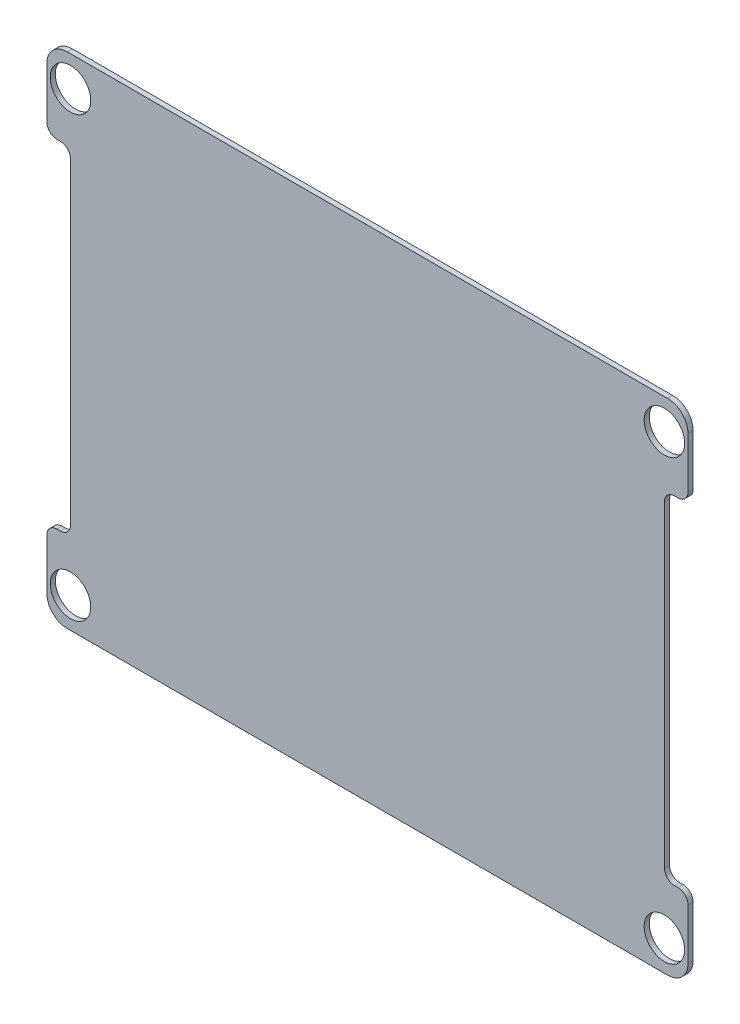
ISO-10303-21;
HEADER;
FILE_DESCRIPTION(('STEP AP214'),'2;1');
FILE_NAME('part.step','',(''),(''),'','','');
FILE_SCHEMA(('AUTOMOTIVE_DESIGN { 1 0 10303 214 1 1 1 1 }'));
ENDSEC;
DATA;
#1=APPLICATION_CONTEXT('core data for automotive mechanical design processes');
#2=APPLICATION_PROTOCOL_DEFINITION('international standard','automotive_design',2000,#1);
#3=PRODUCT_CONTEXT('',#1,'mechanical');
#4=PRODUCT('Part','Part','',(#3));
#5=PRODUCT_RELATED_PRODUCT_CATEGORY('part','',(#4));
#6=PRODUCT_DEFINITION_FORMATION('','',#4);
#7=PRODUCT_DEFINITION_CONTEXT('part definition',#1,'design');
#8=PRODUCT_DEFINITION('design','',#6,#7);
#9=PRODUCT_DEFINITION_SHAPE('','',#8);
#10=(LENGTH_UNIT() NAMED_UNIT(*) SI_UNIT(.MILLI.,.METRE.));
#11=(NAMED_UNIT(*) PLANE_ANGLE_UNIT() SI_UNIT($,.RADIAN.));
#12=(NAMED_UNIT(*) SI_UNIT($,.STERADIAN.) SOLID_ANGLE_UNIT());
#13=UNCERTAINTY_MEASURE_WITH_UNIT(LENGTH_MEASURE(1.E-05),#10,'distance_accuracy_value','');
#14=(GEOMETRIC_REPRESENTATION_CONTEXT(3) GLOBAL_UNCERTAINTY_ASSIGNED_CONTEXT((#13)) GLOBAL_UNIT_ASSIGNED_CONTEXT((#10,
#11,#12)) REPRESENTATION_CONTEXT('',''));
#15=CARTESIAN_POINT('',(0.,0.,0.));
#16=DIRECTION('',(0.,0.,1.));
#17=DIRECTION('',(1.,0.,0.));
#18=AXIS2_PLACEMENT_3D('',#15,#16,#17);
#19=CARTESIAN_POINT('',(-47.5,37.,0.));
#20=DIRECTION('',(0.,0.,1.));
#21=DIRECTION('',(1.,0.,0.));
#22=AXIS2_PLACEMENT_3D('',#19,#20,#21);
#23=PLANE('',#22);
#24=CARTESIAN_POINT('',(-44.50000000001,34.00000000001,0.));
#25=DIRECTION('',(0.,0.,1.));
#26=DIRECTION('',(0.,-1.,0.));
#27=AXIS2_PLACEMENT_3D('',#24,#25,#26);
#28=CIRCLE('',#27,3.00000000001);
#29=CARTESIAN_POINT('',(-44.5,37.,0.));
#30=VERTEX_POINT('',#29);
#31=CARTESIAN_POINT('',(-47.5,34.,0.));
#32=VERTEX_POINT('',#31);
#33=EDGE_CURVE('E42',#30,#32,#28,.T.);
#34=ORIENTED_EDGE('',*,*,#33,.F.);
#35=DIRECTION('',(1.,0.,0.));
#36=VECTOR('',#35,1.);
#37=CARTESIAN_POINT('',(-47.50000000001,37.00000000001,0.));
#38=LINE('',#37,#36);
#39=CARTESIAN_POINT('',(44.5,37.,0.));
#40=VERTEX_POINT('',#39);
#41=EDGE_CURVE('E11',#30,#40,#38,.T.);
#42=ORIENTED_EDGE('',*,*,#41,.T.);
#43=CARTESIAN_POINT('',(44.50000000001,34.00000000001,0.));
#44=DIRECTION('',(0.,0.,-1.));
#45=DIRECTION('',(0.,-1.,0.));
#46=AXIS2_PLACEMENT_3D('',#43,#44,#45);
#47=CIRCLE('',#46,3.00000000001);
#48=CARTESIAN_POINT('',(47.5,34.,0.));
#49=VERTEX_POINT('',#48);
#50=EDGE_CURVE('E28',#40,#49,#47,.T.);
#51=ORIENTED_EDGE('',*,*,#50,.T.);
#52=DIRECTION('',(0.,-1.,0.));
#53=VECTOR('',#52,1.);
#54=CARTESIAN_POINT('',(47.50000000001,37.00000000001,0.));
#55=LINE('',#54,#53);
#56=CARTESIAN_POINT('',(47.5,26.5,0.));
#57=VERTEX_POINT('',#56);
#58=EDGE_CURVE('E298',#49,#57,#55,.T.);
#59=ORIENTED_EDGE('',*,*,#58,.T.);
#60=CARTESIAN_POINT('',(46.00000000001,26.50000000001,0.));
#61=DIRECTION('',(0.,0.,-1.));
#62=DIRECTION('',(0.,1.,0.));
#63=AXIS2_PLACEMENT_3D('',#60,#61,#62);
#64=CIRCLE('',#63,1.50000000001);
#65=CARTESIAN_POINT('',(46.,25.,0.));
#66=VERTEX_POINT('',#65);
#67=EDGE_CURVE('E314',#57,#66,#64,.T.);
#68=ORIENTED_EDGE('',*,*,#67,.T.);
#69=DIRECTION('',(1.,0.,0.));
#70=VECTOR('',#69,1.);
#71=CARTESIAN_POINT('',(-1.75000000001,25.00000000001,0.));
#72=LINE('',#71,#70);
#73=CARTESIAN_POINT('',(45.5,25.,0.));
#74=VERTEX_POINT('',#73);
#75=EDGE_CURVE('E231',#74,#66,#72,.T.);
#76=ORIENTED_EDGE('',*,*,#75,.F.);
#77=CARTESIAN_POINT('',(45.50000000001,23.50000000001,0.));
#78=DIRECTION('',(0.,0.,1.));
#79=DIRECTION('',(0.,1.,0.));
#80=AXIS2_PLACEMENT_3D('',#77,#78,#79);
#81=CIRCLE('',#80,1.50000000001);
#82=CARTESIAN_POINT('',(44.,23.5,0.));
#83=VERTEX_POINT('',#82);
#84=EDGE_CURVE('E317',#74,#83,#81,.T.);
#85=ORIENTED_EDGE('',*,*,#84,.T.);
#86=DIRECTION('',(0.,1.,0.));
#87=VECTOR('',#86,1.);
#88=CARTESIAN_POINT('',(44.00000000001,6.00000000001,0.));
#89=LINE('',#88,#87);
#90=CARTESIAN_POINT('',(44.,-23.5,0.));
#91=VERTEX_POINT('',#90);
#92=EDGE_CURVE('E327',#91,#83,#89,.T.);
#93=ORIENTED_EDGE('',*,*,#92,.F.);
#94=CARTESIAN_POINT('',(45.50000000001,-23.50000000001,0.));
#95=DIRECTION('',(0.,0.,1.));
#96=DIRECTION('',(0.,1.,0.));
#97=AXIS2_PLACEMENT_3D('',#94,#95,#96);
#98=CIRCLE('',#97,1.50000000001);
#99=CARTESIAN_POINT('',(45.5,-25.,0.));
#100=VERTEX_POINT('',#99);
#101=EDGE_CURVE('E318',#91,#100,#98,.T.);
#102=ORIENTED_EDGE('',*,*,#101,.T.);
#103=DIRECTION('',(-1.,0.,0.));
#104=VECTOR('',#103,1.);
#105=CARTESIAN_POINT('',(8.25000000001,-25.00000000001,0.));
#106=LINE('',#105,#104);
#107=CARTESIAN_POINT('',(46.,-25.,0.));
#108=VERTEX_POINT('',#107);
#109=EDGE_CURVE('E272',#108,#100,#106,.T.);
#110=ORIENTED_EDGE('',*,*,#109,.F.);
#111=CARTESIAN_POINT('',(46.00000000001,-26.50000000001,0.));
#112=DIRECTION('',(0.,0.,-1.));
#113=DIRECTION('',(0.,-1.,0.));
#114=AXIS2_PLACEMENT_3D('',#111,#112,#113);
#115=CIRCLE('',#114,1.50000000001);
#116=CARTESIAN_POINT('',(47.5,-26.5,0.));
#117=VERTEX_POINT('',#116);
#118=EDGE_CURVE('E322',#108,#117,#115,.T.);
#119=ORIENTED_EDGE('',*,*,#118,.T.);
#120=CARTESIAN_POINT('',(47.5,-34.,0.));
#121=VERTEX_POINT('',#120);
#122=EDGE_CURVE('E446',#117,#121,#55,.T.);
#123=ORIENTED_EDGE('',*,*,#122,.T.);
#124=CARTESIAN_POINT('',(44.50000000001,-34.00000000001,0.));
#125=DIRECTION('',(0.,0.,-1.));
#126=DIRECTION('',(0.,-1.,0.));
#127=AXIS2_PLACEMENT_3D('',#124,#125,#126);
#128=CIRCLE('',#127,3.00000000001);
#129=CARTESIAN_POINT('',(44.5,-37.,0.));
#130=VERTEX_POINT('',#129);
#131=EDGE_CURVE('E288',#121,#130,#128,.T.);
#132=ORIENTED_EDGE('',*,*,#131,.T.);
#133=DIRECTION('',(-1.,0.,0.));
#134=VECTOR('',#133,1.);
#135=CARTESIAN_POINT('',(47.50000000001,-37.00000000001,0.));
#136=LINE('',#135,#134);
#137=CARTESIAN_POINT('',(-44.5,-37.,0.));
#138=VERTEX_POINT('',#137);
#139=EDGE_CURVE('E285',#130,#138,#136,.T.);
#140=ORIENTED_EDGE('',*,*,#139,.T.);
#141=CARTESIAN_POINT('',(-44.50000000001,-34.00000000001,0.));
#142=DIRECTION('',(0.,0.,-1.));
#143=DIRECTION('',(0.,-1.,0.));
#144=AXIS2_PLACEMENT_3D('',#141,#142,#143);
#145=CIRCLE('',#144,3.00000000001);
#146=CARTESIAN_POINT('',(-47.5,-34.,0.));
#147=VERTEX_POINT('',#146);
#148=EDGE_CURVE('E289',#138,#147,#145,.T.);
#149=ORIENTED_EDGE('',*,*,#148,.T.);
#150=DIRECTION('',(0.,1.,0.));
#151=VECTOR('',#150,1.);
#152=CARTESIAN_POINT('',(-47.50000000001,-37.00000000001,0.));
#153=LINE('',#152,#151);
#154=CARTESIAN_POINT('',(-47.5,-26.5,0.));
#155=VERTEX_POINT('',#154);
#156=EDGE_CURVE('E369',#147,#155,#153,.T.);
#157=ORIENTED_EDGE('',*,*,#156,.T.);
#158=CARTESIAN_POINT('',(-46.00000000001,-26.50000000001,0.));
#159=DIRECTION('',(0.,0.,1.));
#160=DIRECTION('',(0.,1.,0.));
#161=AXIS2_PLACEMENT_3D('',#158,#159,#160);
#162=CIRCLE('',#161,1.50000000001);
#163=CARTESIAN_POINT('',(-46.,-25.,0.));
#164=VERTEX_POINT('',#163);
#165=EDGE_CURVE('E351',#164,#155,#162,.T.);
#166=ORIENTED_EDGE('',*,*,#165,.F.);
#167=DIRECTION('',(-1.,0.,0.));
#168=VECTOR('',#167,1.);
#169=CARTESIAN_POINT('',(-45.75000000001,-25.00000000001,0.));
#170=LINE('',#169,#168);
#171=CARTESIAN_POINT('',(-45.5,-25.,0.));
#172=VERTEX_POINT('',#171);
#173=EDGE_CURVE('E294',#172,#164,#170,.T.);
#174=ORIENTED_EDGE('',*,*,#173,.F.);
#175=CARTESIAN_POINT('',(-45.50000000001,-23.50000000001,0.));
#176=DIRECTION('',(0.,0.,-1.));
#177=DIRECTION('',(0.,1.,0.));
#178=AXIS2_PLACEMENT_3D('',#175,#176,#177);
#179=CIRCLE('',#178,1.50000000001);
#180=CARTESIAN_POINT('',(-44.,-23.5,0.));
#181=VERTEX_POINT('',#180);
#182=EDGE_CURVE('E244',#181,#172,#179,.T.);
#183=ORIENTED_EDGE('',*,*,#182,.F.);
#184=DIRECTION('',(0.,-1.,0.));
#185=VECTOR('',#184,1.);
#186=CARTESIAN_POINT('',(-44.00000000001,31.00000000001,0.));
#187=LINE('',#186,#185);
#188=CARTESIAN_POINT('',(-44.,23.5,0.));
#189=VERTEX_POINT('',#188);
#190=EDGE_CURVE('E383',#189,#181,#187,.T.);
#191=ORIENTED_EDGE('',*,*,#190,.F.);
#192=CARTESIAN_POINT('',(-45.50000000001,23.50000000001,0.));
#193=DIRECTION('',(0.,0.,-1.));
#194=DIRECTION('',(0.,1.,0.));
#195=AXIS2_PLACEMENT_3D('',#192,#193,#194);
#196=CIRCLE('',#195,1.50000000001);
#197=CARTESIAN_POINT('',(-45.5,25.,0.));
#198=VERTEX_POINT('',#197);
#199=EDGE_CURVE('E326',#198,#189,#196,.T.);
#200=ORIENTED_EDGE('',*,*,#199,.F.);
#201=DIRECTION('',(1.,0.,0.));
#202=VECTOR('',#201,1.);
#203=CARTESIAN_POINT('',(-55.75000000001,25.00000000001,0.));
#204=LINE('',#203,#202);
#205=CARTESIAN_POINT('',(-46.,25.,0.));
#206=VERTEX_POINT('',#205);
#207=EDGE_CURVE('E284',#206,#198,#204,.T.);
#208=ORIENTED_EDGE('',*,*,#207,.F.);
#209=CARTESIAN_POINT('',(-46.00000000001,26.50000000001,0.));
#210=DIRECTION('',(0.,0.,1.));
#211=DIRECTION('',(0.,-1.,0.));
#212=AXIS2_PLACEMENT_3D('',#209,#210,#211);
#213=CIRCLE('',#212,1.50000000001);
#214=CARTESIAN_POINT('',(-47.5,26.5,0.));
#215=VERTEX_POINT('',#214);
#216=EDGE_CURVE('E463',#215,#206,#213,.T.);
#217=ORIENTED_EDGE('',*,*,#216,.F.);
#218=EDGE_CURVE('E366',#215,#32,#153,.T.);
#219=ORIENTED_EDGE('',*,*,#218,.T.);
#220=EDGE_LOOP('',(#34,#42,#51,#59,#68,#76,#85,#93,#102,#110,#119,#123,#132,#140,#149,#157,#166,
#174,#183,#191,#200,#208,#217,#219));
#221=FACE_BOUND('',#220,.T.);
#222=CARTESIAN_POINT('',(-44.00000000001,-32.50000000001,0.));
#223=DIRECTION('',(0.,0.,1.));
#224=DIRECTION('',(1.,0.,0.));
#225=AXIS2_PLACEMENT_3D('',#222,#223,#224);
#226=CIRCLE('',#225,3.00000000001);
#227=CARTESIAN_POINT('',(-41.,-32.50000000001,0.));
#228=VERTEX_POINT('',#227);
#229=EDGE_CURVE('E370',#228,#228,#226,.T.);
#230=ORIENTED_EDGE('',*,*,#229,.T.);
#231=EDGE_LOOP('',(#230));
#232=FACE_BOUND('',#231,.T.);
#233=CARTESIAN_POINT('',(44.00000000001,-32.50000000001,0.));
#234=DIRECTION('',(0.,0.,1.));
#235=DIRECTION('',(1.,0.,0.));
#236=AXIS2_PLACEMENT_3D('',#233,#234,#235);
#237=CIRCLE('',#236,3.00000000001);
#238=CARTESIAN_POINT('',(47.00000000002,-32.50000000001,0.));
#239=VERTEX_POINT('',#238);
#240=EDGE_CURVE('E308',#239,#239,#237,.T.);
#241=ORIENTED_EDGE('',*,*,#240,.T.);
#242=EDGE_LOOP('',(#241));
#243=FACE_BOUND('',#242,.T.);
#244=CARTESIAN_POINT('',(44.00000000001,32.50000000001,0.));
#245=DIRECTION('',(0.,0.,1.));
#246=DIRECTION('',(1.,0.,0.));
#247=AXIS2_PLACEMENT_3D('',#244,#245,#246);
#248=CIRCLE('',#247,3.00000000001);
#249=CARTESIAN_POINT('',(47.00000000002,32.50000000001,0.));
#250=VERTEX_POINT('',#249);
#251=EDGE_CURVE('E304',#250,#250,#248,.T.);
#252=ORIENTED_EDGE('',*,*,#251,.T.);
#253=EDGE_LOOP('',(#252));
#254=FACE_BOUND('',#253,.T.);
#255=CARTESIAN_POINT('',(-44.00000000001,32.50000000001,0.));
#256=DIRECTION('',(0.,0.,1.));
#257=DIRECTION('',(1.,0.,0.));
#258=AXIS2_PLACEMENT_3D('',#255,#256,#257);
#259=CIRCLE('',#258,3.00000000001);
#260=CARTESIAN_POINT('',(-41.,32.50000000001,0.));
#261=VERTEX_POINT('',#260);
#262=EDGE_CURVE('E278',#261,#261,#259,.T.);
#263=ORIENTED_EDGE('',*,*,#262,.T.);
#264=EDGE_LOOP('',(#263));
#265=FACE_BOUND('',#264,.T.);
#266=ADVANCED_FACE('F17',(#221,#232,#243,#254,#265),#23,.F.);
#267=CARTESIAN_POINT('',(-47.5,-37.,0.));
#268=DIRECTION('',(-1.,0.,0.));
#269=DIRECTION('',(0.,0.,1.));
#270=AXIS2_PLACEMENT_3D('',#267,#268,#269);
#271=PLANE('',#270);
#272=ORIENTED_EDGE('',*,*,#218,.F.);
#273=DIRECTION('',(0.,0.,1.));
#274=VECTOR('',#273,1.);
#275=CARTESIAN_POINT('',(-47.50000000001,26.50000000001,0.));
#276=LINE('',#275,#274);
#277=CARTESIAN_POINT('',(-47.5,26.5,0.76));
#278=VERTEX_POINT('',#277);
#279=EDGE_CURVE('E274',#215,#278,#276,.T.);
#280=ORIENTED_EDGE('',*,*,#279,.T.);
#281=DIRECTION('',(0.,1.,0.));
#282=VECTOR('',#281,1.);
#283=CARTESIAN_POINT('',(-47.50000000001,-37.00000000001,0.76000000001));
#284=LINE('',#283,#282);
#285=CARTESIAN_POINT('',(-47.5,34.,0.76));
#286=VERTEX_POINT('',#285);
#287=EDGE_CURVE('E279',#278,#286,#284,.T.);
#288=ORIENTED_EDGE('',*,*,#287,.T.);
#289=DIRECTION('',(0.,0.,1.));
#290=VECTOR('',#289,1.);
#291=CARTESIAN_POINT('',(-47.50000000001,34.00000000001,0.));
#292=LINE('',#291,#290);
#293=EDGE_CURVE('E280',#32,#286,#292,.T.);
#294=ORIENTED_EDGE('',*,*,#293,.F.);
#295=EDGE_LOOP('',(#272,#280,#288,#294));
#296=FACE_BOUND('',#295,.T.);
#297=ADVANCED_FACE('F661',(#296),#271,.T.);
#298=CARTESIAN_POINT('',(-46.,26.5,0.));
#299=DIRECTION('',(0.,0.,1.));
#300=DIRECTION('',(-1.,0.,0.));
#301=AXIS2_PLACEMENT_3D('',#298,#299,#300);
#302=CYLINDRICAL_SURFACE('',#301,1.5);
#303=ORIENTED_EDGE('',*,*,#216,.T.);
#304=DIRECTION('',(0.,0.,1.));
#305=VECTOR('',#304,1.);
#306=CARTESIAN_POINT('',(-46.00000000001,25.00000000001,0.));
#307=LINE('',#306,#305);
#308=CARTESIAN_POINT('',(-46.,25.,0.76));
#309=VERTEX_POINT('',#308);
#310=EDGE_CURVE('E386',#206,#309,#307,.T.);
#311=ORIENTED_EDGE('',*,*,#310,.T.);
#312=CARTESIAN_POINT('',(-46.00000000001,26.50000000001,0.76000000001));
#313=DIRECTION('',(0.,0.,1.));
#314=DIRECTION('',(0.,-1.,0.));
#315=AXIS2_PLACEMENT_3D('',#312,#313,#314);
#316=CIRCLE('',#315,1.50000000001);
#317=EDGE_CURVE('E409',#278,#309,#316,.T.);
#318=ORIENTED_EDGE('',*,*,#317,.F.);
#319=ORIENTED_EDGE('',*,*,#279,.F.);
#320=EDGE_LOOP('',(#303,#311,#318,#319));
#321=FACE_BOUND('',#320,.T.);
#322=ADVANCED_FACE('F889',(#321),#302,.T.);
#323=CARTESIAN_POINT('',(-44.5,34.,0.));
#324=DIRECTION('',(0.,0.,1.));
#325=DIRECTION('',(0.,1.,0.));
#326=AXIS2_PLACEMENT_3D('',#323,#324,#325);
#327=CYLINDRICAL_SURFACE('',#326,3.);
#328=ORIENTED_EDGE('',*,*,#33,.T.);
#329=ORIENTED_EDGE('',*,*,#293,.T.);
#330=CARTESIAN_POINT('',(-44.50000000001,34.00000000001,0.76000000001));
#331=DIRECTION('',(0.,0.,1.));
#332=DIRECTION('',(0.,-1.,0.));
#333=AXIS2_PLACEMENT_3D('',#330,#331,#332);
#334=CIRCLE('',#333,3.00000000001);
#335=CARTESIAN_POINT('',(-44.5,37.,0.76));
#336=VERTEX_POINT('',#335);
#337=EDGE_CURVE('E254',#336,#286,#334,.T.);
#338=ORIENTED_EDGE('',*,*,#337,.F.);
#339=DIRECTION('',(0.,0.,1.));
#340=VECTOR('',#339,1.);
#341=CARTESIAN_POINT('',(-44.50000000001,37.00000000001,0.));
#342=LINE('',#341,#340);
#343=EDGE_CURVE('E21',#30,#336,#342,.T.);
#344=ORIENTED_EDGE('',*,*,#343,.F.);
#345=EDGE_LOOP('',(#328,#329,#338,#344));
#346=FACE_BOUND('',#345,.T.);
#347=ADVANCED_FACE('F19',(#346),#327,.T.);
#348=CARTESIAN_POINT('',(-64.,25.,0.76));
#349=DIRECTION('',(0.,-1.,0.));
#350=DIRECTION('',(0.,0.,-1.));
#351=AXIS2_PLACEMENT_3D('',#348,#349,#350);
#352=PLANE('',#351);
#353=DIRECTION('',(1.,0.,0.));
#354=VECTOR('',#353,1.);
#355=CARTESIAN_POINT('',(-64.00000000001,25.00000000001,0.76000000001));
#356=LINE('',#355,#354);
#357=CARTESIAN_POINT('',(-45.5,25.,0.76));
#358=VERTEX_POINT('',#357);
#359=EDGE_CURVE('E267',#309,#358,#356,.T.);
#360=ORIENTED_EDGE('',*,*,#359,.F.);
#361=ORIENTED_EDGE('',*,*,#310,.F.);
#362=ORIENTED_EDGE('',*,*,#207,.T.);
#363=DIRECTION('',(0.,0.,-1.));
#364=VECTOR('',#363,1.);
#365=CARTESIAN_POINT('',(-45.50000000001,25.00000000001,0.76000000001));
#366=LINE('',#365,#364);
#367=EDGE_CURVE('E313',#358,#198,#366,.T.);
#368=ORIENTED_EDGE('',*,*,#367,.F.);
#369=EDGE_LOOP('',(#360,#361,#362,#368));
#370=FACE_BOUND('',#369,.T.);
#371=ADVANCED_FACE('F874',(#370),#352,.T.);
#372=CARTESIAN_POINT('',(-47.5,37.,0.));
#373=DIRECTION('',(0.,1.,0.));
#374=DIRECTION('',(1.,0.,0.));
#375=AXIS2_PLACEMENT_3D('',#372,#373,#374);
#376=PLANE('',#375);
#377=ORIENTED_EDGE('',*,*,#41,.F.);
#378=ORIENTED_EDGE('',*,*,#343,.T.);
#379=DIRECTION('',(1.,0.,0.));
#380=VECTOR('',#379,1.);
#381=CARTESIAN_POINT('',(-47.50000000001,37.00000000001,0.76000000001));
#382=LINE('',#381,#380);
#383=CARTESIAN_POINT('',(44.5,37.,0.76));
#384=VERTEX_POINT('',#383);
#385=EDGE_CURVE('E309',#336,#384,#382,.T.);
#386=ORIENTED_EDGE('',*,*,#385,.T.);
#387=DIRECTION('',(0.,0.,1.));
#388=VECTOR('',#387,1.);
#389=CARTESIAN_POINT('',(44.50000000001,37.00000000001,0.));
#390=LINE('',#389,#388);
#391=EDGE_CURVE('E454',#40,#384,#390,.T.);
#392=ORIENTED_EDGE('',*,*,#391,.F.);
#393=EDGE_LOOP('',(#377,#378,#386,#392));
#394=FACE_BOUND('',#393,.T.);
#395=ADVANCED_FACE('F866',(#394),#376,.T.);
#396=CARTESIAN_POINT('',(-45.5,23.5,0.76));
#397=DIRECTION('',(0.,0.,-1.));
#398=DIRECTION('',(0.,1.,0.));
#399=AXIS2_PLACEMENT_3D('',#396,#397,#398);
#400=CYLINDRICAL_SURFACE('',#399,1.5);
#401=ORIENTED_EDGE('',*,*,#367,.T.);
#402=ORIENTED_EDGE('',*,*,#199,.T.);
#403=DIRECTION('',(0.,0.,-1.));
#404=VECTOR('',#403,1.);
#405=CARTESIAN_POINT('',(-44.00000000001,23.50000000001,0.76000000001));
#406=LINE('',#405,#404);
#407=CARTESIAN_POINT('',(-44.,23.5,0.76));
#408=VERTEX_POINT('',#407);
#409=EDGE_CURVE('E415',#408,#189,#406,.T.);
#410=ORIENTED_EDGE('',*,*,#409,.F.);
#411=CARTESIAN_POINT('',(-45.50000000001,23.50000000001,0.76000000001));
#412=DIRECTION('',(0.,0.,-1.));
#413=DIRECTION('',(0.,1.,0.));
#414=AXIS2_PLACEMENT_3D('',#411,#412,#413);
#415=CIRCLE('',#414,1.50000000001);
#416=EDGE_CURVE('E437',#358,#408,#415,.T.);
#417=ORIENTED_EDGE('',*,*,#416,.F.);
#418=EDGE_LOOP('',(#401,#402,#410,#417));
#419=FACE_BOUND('',#418,.T.);
#420=ADVANCED_FACE('F858',(#419),#400,.F.);
#421=CARTESIAN_POINT('',(44.5,34.,0.));
#422=DIRECTION('',(0.,0.,1.));
#423=DIRECTION('',(0.,1.,0.));
#424=AXIS2_PLACEMENT_3D('',#421,#422,#423);
#425=CYLINDRICAL_SURFACE('',#424,3.);
#426=ORIENTED_EDGE('',*,*,#391,.T.);
#427=CARTESIAN_POINT('',(44.50000000001,34.00000000001,0.76000000001));
#428=DIRECTION('',(0.,0.,-1.));
#429=DIRECTION('',(0.,-1.,0.));
#430=AXIS2_PLACEMENT_3D('',#427,#428,#429);
#431=CIRCLE('',#430,3.00000000001);
#432=CARTESIAN_POINT('',(47.5,34.,0.76));
#433=VERTEX_POINT('',#432);
#434=EDGE_CURVE('E436',#384,#433,#431,.T.);
#435=ORIENTED_EDGE('',*,*,#434,.T.);
#436=DIRECTION('',(0.,0.,1.));
#437=VECTOR('',#436,1.);
#438=CARTESIAN_POINT('',(47.50000000001,34.00000000001,0.));
#439=LINE('',#438,#437);
#440=EDGE_CURVE('E380',#49,#433,#439,.T.);
#441=ORIENTED_EDGE('',*,*,#440,.F.);
#442=ORIENTED_EDGE('',*,*,#50,.F.);
#443=EDGE_LOOP('',(#426,#435,#441,#442));
#444=FACE_BOUND('',#443,.T.);
#445=ADVANCED_FACE('F851',(#444),#425,.T.);
#446=CARTESIAN_POINT('',(-44.,25.,0.76));
#447=DIRECTION('',(-1.,0.,0.));
#448=DIRECTION('',(0.,0.,1.));
#449=AXIS2_PLACEMENT_3D('',#446,#447,#448);
#450=PLANE('',#449);
#451=DIRECTION('',(0.,-1.,0.));
#452=VECTOR('',#451,1.);
#453=CARTESIAN_POINT('',(-44.00000000001,25.00000000001,0.76000000001));
#454=LINE('',#453,#452);
#455=CARTESIAN_POINT('',(-44.,-23.5,0.76));
#456=VERTEX_POINT('',#455);
#457=EDGE_CURVE('E344',#408,#456,#454,.T.);
#458=ORIENTED_EDGE('',*,*,#457,.F.);
#459=ORIENTED_EDGE('',*,*,#409,.T.);
#460=ORIENTED_EDGE('',*,*,#190,.T.);
#461=DIRECTION('',(0.,0.,-1.));
#462=VECTOR('',#461,1.);
#463=CARTESIAN_POINT('',(-44.00000000001,-23.50000000001,0.76000000001));
#464=LINE('',#463,#462);
#465=EDGE_CURVE('E467',#456,#181,#464,.T.);
#466=ORIENTED_EDGE('',*,*,#465,.F.);
#467=EDGE_LOOP('',(#458,#459,#460,#466));
#468=FACE_BOUND('',#467,.T.);
#469=ADVANCED_FACE('F530',(#468),#450,.T.);
#470=CARTESIAN_POINT('',(47.5,37.,0.));
#471=DIRECTION('',(1.,0.,0.));
#472=DIRECTION('',(0.,1.,0.));
#473=AXIS2_PLACEMENT_3D('',#470,#471,#472);
#474=PLANE('',#473);
#475=ORIENTED_EDGE('',*,*,#58,.F.);
#476=ORIENTED_EDGE('',*,*,#440,.T.);
#477=DIRECTION('',(0.,-1.,0.));
#478=VECTOR('',#477,1.);
#479=CARTESIAN_POINT('',(47.50000000001,37.00000000001,0.76000000001));
#480=LINE('',#479,#478);
#481=CARTESIAN_POINT('',(47.5,26.5,0.76));
#482=VERTEX_POINT('',#481);
#483=EDGE_CURVE('E384',#433,#482,#480,.T.);
#484=ORIENTED_EDGE('',*,*,#483,.T.);
#485=DIRECTION('',(0.,0.,-1.));
#486=VECTOR('',#485,1.);
#487=CARTESIAN_POINT('',(47.50000000001,26.50000000001,0.76000000001));
#488=LINE('',#487,#486);
#489=EDGE_CURVE('E240',#482,#57,#488,.T.);
#490=ORIENTED_EDGE('',*,*,#489,.T.);
#491=EDGE_LOOP('',(#475,#476,#484,#490));
#492=FACE_BOUND('',#491,.T.);
#493=ADVANCED_FACE('F524',(#492),#474,.T.);
#494=CARTESIAN_POINT('',(-45.5,-23.5,0.76));
#495=DIRECTION('',(0.,0.,-1.));
#496=DIRECTION('',(1.,0.,0.));
#497=AXIS2_PLACEMENT_3D('',#494,#495,#496);
#498=CYLINDRICAL_SURFACE('',#497,1.5);
#499=ORIENTED_EDGE('',*,*,#465,.T.);
#500=ORIENTED_EDGE('',*,*,#182,.T.);
#501=DIRECTION('',(0.,0.,-1.));
#502=VECTOR('',#501,1.);
#503=CARTESIAN_POINT('',(-45.50000000001,-25.00000000001,0.76000000001));
#504=LINE('',#503,#502);
#505=CARTESIAN_POINT('',(-45.5,-25.,0.76));
#506=VERTEX_POINT('',#505);
#507=EDGE_CURVE('E235',#506,#172,#504,.T.);
#508=ORIENTED_EDGE('',*,*,#507,.F.);
#509=CARTESIAN_POINT('',(-45.50000000001,-23.50000000001,0.76000000001));
#510=DIRECTION('',(0.,0.,-1.));
#511=DIRECTION('',(0.,1.,0.));
#512=AXIS2_PLACEMENT_3D('',#509,#510,#511);
#513=CIRCLE('',#512,1.50000000001);
#514=EDGE_CURVE('E341',#456,#506,#513,.T.);
#515=ORIENTED_EDGE('',*,*,#514,.F.);
#516=EDGE_LOOP('',(#499,#500,#508,#515));
#517=FACE_BOUND('',#516,.T.);
#518=ADVANCED_FACE('F496',(#517),#498,.F.);
#519=CARTESIAN_POINT('',(46.,26.5,0.76));
#520=DIRECTION('',(0.,0.,-1.));
#521=DIRECTION('',(1.,0.,0.));
#522=AXIS2_PLACEMENT_3D('',#519,#520,#521);
#523=CYLINDRICAL_SURFACE('',#522,1.5);
#524=CARTESIAN_POINT('',(46.00000000001,26.50000000001,0.76000000001));
#525=DIRECTION('',(0.,0.,-1.));
#526=DIRECTION('',(0.,1.,0.));
#527=AXIS2_PLACEMENT_3D('',#524,#525,#526);
#528=CIRCLE('',#527,1.50000000001);
#529=CARTESIAN_POINT('',(46.,25.,0.76));
#530=VERTEX_POINT('',#529);
#531=EDGE_CURVE('E234',#482,#530,#528,.T.);
#532=ORIENTED_EDGE('',*,*,#531,.T.);
#533=DIRECTION('',(0.,0.,-1.));
#534=VECTOR('',#533,1.);
#535=CARTESIAN_POINT('',(46.00000000001,25.00000000001,0.76000000001));
#536=LINE('',#535,#534);
#537=EDGE_CURVE('E223',#530,#66,#536,.T.);
#538=ORIENTED_EDGE('',*,*,#537,.T.);
#539=ORIENTED_EDGE('',*,*,#67,.F.);
#540=ORIENTED_EDGE('',*,*,#489,.F.);
#541=EDGE_LOOP('',(#532,#538,#539,#540));
#542=FACE_BOUND('',#541,.T.);
#543=ADVANCED_FACE('F238',(#542),#523,.T.);
#544=CARTESIAN_POINT('',(-44.,-25.,0.76));
#545=DIRECTION('',(0.,1.,0.));
#546=DIRECTION('',(1.,0.,0.));
#547=AXIS2_PLACEMENT_3D('',#544,#545,#546);
#548=PLANE('',#547);
#549=DIRECTION('',(-1.,0.,0.));
#550=VECTOR('',#549,1.);
#551=CARTESIAN_POINT('',(-44.00000000001,-25.00000000001,0.76000000001));
#552=LINE('',#551,#550);
#553=CARTESIAN_POINT('',(-46.,-25.,0.76));
#554=VERTEX_POINT('',#553);
#555=EDGE_CURVE('E345',#506,#554,#552,.T.);
#556=ORIENTED_EDGE('',*,*,#555,.F.);
#557=ORIENTED_EDGE('',*,*,#507,.T.);
#558=ORIENTED_EDGE('',*,*,#173,.T.);
#559=DIRECTION('',(0.,0.,-1.));
#560=VECTOR('',#559,1.);
#561=CARTESIAN_POINT('',(-46.00000000001,-25.00000000001,0.76000000001));
#562=LINE('',#561,#560);
#563=EDGE_CURVE('E372',#554,#164,#562,.T.);
#564=ORIENTED_EDGE('',*,*,#563,.F.);
#565=EDGE_LOOP('',(#556,#557,#558,#564));
#566=FACE_BOUND('',#565,.T.);
#567=ADVANCED_FACE('F502',(#566),#548,.T.);
#568=CARTESIAN_POINT('',(44.,25.,0.76));
#569=DIRECTION('',(0.,-1.,0.));
#570=DIRECTION('',(0.,0.,-1.));
#571=AXIS2_PLACEMENT_3D('',#568,#569,#570);
#572=PLANE('',#571);
#573=DIRECTION('',(1.,0.,0.));
#574=VECTOR('',#573,1.);
#575=CARTESIAN_POINT('',(44.00000000001,25.00000000001,0.76000000001));
#576=LINE('',#575,#574);
#577=CARTESIAN_POINT('',(45.5,25.,0.76));
#578=VERTEX_POINT('',#577);
#579=EDGE_CURVE('E228',#578,#530,#576,.T.);
#580=ORIENTED_EDGE('',*,*,#579,.F.);
#581=DIRECTION('',(0.,0.,-1.));
#582=VECTOR('',#581,1.);
#583=CARTESIAN_POINT('',(45.50000000001,25.00000000001,0.76000000001));
#584=LINE('',#583,#582);
#585=EDGE_CURVE('E291',#578,#74,#584,.T.);
#586=ORIENTED_EDGE('',*,*,#585,.T.);
#587=ORIENTED_EDGE('',*,*,#75,.T.);
#588=ORIENTED_EDGE('',*,*,#537,.F.);
#589=EDGE_LOOP('',(#580,#586,#587,#588));
#590=FACE_BOUND('',#589,.T.);
#591=ADVANCED_FACE('F225',(#590),#572,.T.);
#592=CARTESIAN_POINT('',(-46.,-26.5,0.76));
#593=DIRECTION('',(0.,0.,-1.));
#594=DIRECTION('',(0.,1.,0.));
#595=AXIS2_PLACEMENT_3D('',#592,#593,#594);
#596=CYLINDRICAL_SURFACE('',#595,1.5);
#597=ORIENTED_EDGE('',*,*,#563,.T.);
#598=ORIENTED_EDGE('',*,*,#165,.T.);
#599=DIRECTION('',(0.,0.,-1.));
#600=VECTOR('',#599,1.);
#601=CARTESIAN_POINT('',(-47.50000000001,-26.50000000001,0.76000000001));
#602=LINE('',#601,#600);
#603=CARTESIAN_POINT('',(-47.5,-26.5,0.76));
#604=VERTEX_POINT('',#603);
#605=EDGE_CURVE('E424',#604,#155,#602,.T.);
#606=ORIENTED_EDGE('',*,*,#605,.F.);
#607=CARTESIAN_POINT('',(-46.00000000001,-26.50000000001,0.76000000001));
#608=DIRECTION('',(0.,0.,1.));
#609=DIRECTION('',(0.,1.,0.));
#610=AXIS2_PLACEMENT_3D('',#607,#608,#609);
#611=CIRCLE('',#610,1.50000000001);
#612=EDGE_CURVE('E423',#554,#604,#611,.T.);
#613=ORIENTED_EDGE('',*,*,#612,.F.);
#614=EDGE_LOOP('',(#597,#598,#606,#613));
#615=FACE_BOUND('',#614,.T.);
#616=ADVANCED_FACE('F617',(#615),#596,.T.);
#617=CARTESIAN_POINT('',(45.5,23.5,0.76));
#618=DIRECTION('',(0.,0.,-1.));
#619=DIRECTION('',(0.,1.,0.));
#620=AXIS2_PLACEMENT_3D('',#617,#618,#619);
#621=CYLINDRICAL_SURFACE('',#620,1.5);
#622=CARTESIAN_POINT('',(45.50000000001,23.50000000001,0.76000000001));
#623=DIRECTION('',(0.,0.,1.));
#624=DIRECTION('',(0.,1.,0.));
#625=AXIS2_PLACEMENT_3D('',#622,#623,#624);
#626=CIRCLE('',#625,1.50000000001);
#627=CARTESIAN_POINT('',(44.,23.5,0.76));
#628=VERTEX_POINT('',#627);
#629=EDGE_CURVE('E251',#578,#628,#626,.T.);
#630=ORIENTED_EDGE('',*,*,#629,.T.);
#631=DIRECTION('',(0.,0.,-1.));
#632=VECTOR('',#631,1.);
#633=CARTESIAN_POINT('',(44.00000000001,23.50000000001,0.76000000001));
#634=LINE('',#633,#632);
#635=EDGE_CURVE('E352',#628,#83,#634,.T.);
#636=ORIENTED_EDGE('',*,*,#635,.T.);
#637=ORIENTED_EDGE('',*,*,#84,.F.);
#638=ORIENTED_EDGE('',*,*,#585,.F.);
#639=EDGE_LOOP('',(#630,#636,#637,#638));
#640=FACE_BOUND('',#639,.T.);
#641=ADVANCED_FACE('F635',(#640),#621,.F.);
#642=ORIENTED_EDGE('',*,*,#156,.F.);
#643=DIRECTION('',(0.,0.,1.));
#644=VECTOR('',#643,1.);
#645=CARTESIAN_POINT('',(-47.50000000001,-34.00000000001,0.));
#646=LINE('',#645,#644);
#647=CARTESIAN_POINT('',(-47.5,-34.,0.76));
#648=VERTEX_POINT('',#647);
#649=EDGE_CURVE('E450',#147,#648,#646,.T.);
#650=ORIENTED_EDGE('',*,*,#649,.T.);
#651=EDGE_CURVE('E428',#648,#604,#284,.T.);
#652=ORIENTED_EDGE('',*,*,#651,.T.);
#653=ORIENTED_EDGE('',*,*,#605,.T.);
#654=EDGE_LOOP('',(#642,#650,#652,#653));
#655=FACE_BOUND('',#654,.T.);
#656=ADVANCED_FACE('F646',(#655),#271,.T.);
#657=CARTESIAN_POINT('',(44.,-25.,0.76));
#658=DIRECTION('',(1.,0.,0.));
#659=DIRECTION('',(0.,1.,0.));
#660=AXIS2_PLACEMENT_3D('',#657,#658,#659);
#661=PLANE('',#660);
#662=DIRECTION('',(0.,1.,0.));
#663=VECTOR('',#662,1.);
#664=CARTESIAN_POINT('',(44.00000000001,-25.00000000001,0.76000000001));
#665=LINE('',#664,#663);
#666=CARTESIAN_POINT('',(44.,-23.5,0.76));
#667=VERTEX_POINT('',#666);
#668=EDGE_CURVE('E253',#667,#628,#665,.T.);
#669=ORIENTED_EDGE('',*,*,#668,.F.);
#670=DIRECTION('',(0.,0.,-1.));
#671=VECTOR('',#670,1.);
#672=CARTESIAN_POINT('',(44.00000000001,-23.50000000001,0.76000000001));
#673=LINE('',#672,#671);
#674=EDGE_CURVE('E330',#667,#91,#673,.T.);
#675=ORIENTED_EDGE('',*,*,#674,.T.);
#676=ORIENTED_EDGE('',*,*,#92,.T.);
#677=ORIENTED_EDGE('',*,*,#635,.F.);
#678=EDGE_LOOP('',(#669,#675,#676,#677));
#679=FACE_BOUND('',#678,.T.);
#680=ADVANCED_FACE('F658',(#679),#661,.T.);
#681=CARTESIAN_POINT('',(-44.5,-34.,0.));
#682=DIRECTION('',(0.,0.,1.));
#683=DIRECTION('',(0.,-1.,0.));
#684=AXIS2_PLACEMENT_3D('',#681,#682,#683);
#685=CYLINDRICAL_SURFACE('',#684,3.);
#686=DIRECTION('',(0.,0.,1.));
#687=VECTOR('',#686,1.);
#688=CARTESIAN_POINT('',(-44.50000000001,-37.00000000001,0.));
#689=LINE('',#688,#687);
#690=CARTESIAN_POINT('',(-44.5,-37.,0.76));
#691=VERTEX_POINT('',#690);
#692=EDGE_CURVE('E331',#138,#691,#689,.T.);
#693=ORIENTED_EDGE('',*,*,#692,.T.);
#694=CARTESIAN_POINT('',(-44.50000000001,-34.00000000001,0.76000000001));
#695=DIRECTION('',(0.,0.,-1.));
#696=DIRECTION('',(0.,-1.,0.));
#697=AXIS2_PLACEMENT_3D('',#694,#695,#696);
#698=CIRCLE('',#697,3.00000000001);
#699=EDGE_CURVE('E357',#691,#648,#698,.T.);
#700=ORIENTED_EDGE('',*,*,#699,.T.);
#701=ORIENTED_EDGE('',*,*,#649,.F.);
#702=ORIENTED_EDGE('',*,*,#148,.F.);
#703=EDGE_LOOP('',(#693,#700,#701,#702));
#704=FACE_BOUND('',#703,.T.);
#705=ADVANCED_FACE('F672',(#704),#685,.T.);
#706=CARTESIAN_POINT('',(45.5,-23.5,0.76));
#707=DIRECTION('',(0.,0.,-1.));
#708=DIRECTION('',(-1.,0.,0.));
#709=AXIS2_PLACEMENT_3D('',#706,#707,#708);
#710=CYLINDRICAL_SURFACE('',#709,1.5);
#711=CARTESIAN_POINT('',(45.50000000001,-23.50000000001,0.76000000001));
#712=DIRECTION('',(0.,0.,1.));
#713=DIRECTION('',(0.,1.,0.));
#714=AXIS2_PLACEMENT_3D('',#711,#712,#713);
#715=CIRCLE('',#714,1.50000000001);
#716=CARTESIAN_POINT('',(45.5,-25.,0.76));
#717=VERTEX_POINT('',#716);
#718=EDGE_CURVE('E353',#667,#717,#715,.T.);
#719=ORIENTED_EDGE('',*,*,#718,.T.);
#720=DIRECTION('',(0.,0.,-1.));
#721=VECTOR('',#720,1.);
#722=CARTESIAN_POINT('',(45.50000000001,-25.00000000001,0.76000000001));
#723=LINE('',#722,#721);
#724=EDGE_CURVE('E358',#717,#100,#723,.T.);
#725=ORIENTED_EDGE('',*,*,#724,.T.);
#726=ORIENTED_EDGE('',*,*,#101,.F.);
#727=ORIENTED_EDGE('',*,*,#674,.F.);
#728=EDGE_LOOP('',(#719,#725,#726,#727));
#729=FACE_BOUND('',#728,.T.);
#730=ADVANCED_FACE('F685',(#729),#710,.F.);
#731=CARTESIAN_POINT('',(47.5,-37.,0.));
#732=DIRECTION('',(0.,-1.,0.));
#733=DIRECTION('',(0.,0.,-1.));
#734=AXIS2_PLACEMENT_3D('',#731,#732,#733);
#735=PLANE('',#734);
#736=ORIENTED_EDGE('',*,*,#139,.F.);
#737=DIRECTION('',(0.,0.,1.));
#738=VECTOR('',#737,1.);
#739=CARTESIAN_POINT('',(44.50000000001,-37.00000000001,0.));
#740=LINE('',#739,#738);
#741=CARTESIAN_POINT('',(44.5,-37.,0.76));
#742=VERTEX_POINT('',#741);
#743=EDGE_CURVE('E396',#130,#742,#740,.T.);
#744=ORIENTED_EDGE('',*,*,#743,.T.);
#745=DIRECTION('',(-1.,0.,0.));
#746=VECTOR('',#745,1.);
#747=CARTESIAN_POINT('',(47.50000000001,-37.00000000001,0.76000000001));
#748=LINE('',#747,#746);
#749=EDGE_CURVE('E348',#742,#691,#748,.T.);
#750=ORIENTED_EDGE('',*,*,#749,.T.);
#751=ORIENTED_EDGE('',*,*,#692,.F.);
#752=EDGE_LOOP('',(#736,#744,#750,#751));
#753=FACE_BOUND('',#752,.T.);
#754=ADVANCED_FACE('F697',(#753),#735,.T.);
#755=CARTESIAN_POINT('',(64.,-25.,0.76));
#756=DIRECTION('',(0.,1.,0.));
#757=DIRECTION('',(1.,0.,0.));
#758=AXIS2_PLACEMENT_3D('',#755,#756,#757);
#759=PLANE('',#758);
#760=DIRECTION('',(-1.,0.,0.));
#761=VECTOR('',#760,1.);
#762=CARTESIAN_POINT('',(64.00000000001,-25.00000000001,0.76000000001));
#763=LINE('',#762,#761);
#764=CARTESIAN_POINT('',(46.,-25.,0.76));
#765=VERTEX_POINT('',#764);
#766=EDGE_CURVE('E260',#765,#717,#763,.T.);
#767=ORIENTED_EDGE('',*,*,#766,.F.);
#768=DIRECTION('',(0.,0.,1.));
#769=VECTOR('',#768,1.);
#770=CARTESIAN_POINT('',(46.00000000001,-25.00000000001,0.));
#771=LINE('',#770,#769);
#772=EDGE_CURVE('E299',#108,#765,#771,.T.);
#773=ORIENTED_EDGE('',*,*,#772,.F.);
#774=ORIENTED_EDGE('',*,*,#109,.T.);
#775=ORIENTED_EDGE('',*,*,#724,.F.);
#776=EDGE_LOOP('',(#767,#773,#774,#775));
#777=FACE_BOUND('',#776,.T.);
#778=ADVANCED_FACE('F709',(#777),#759,.T.);
#779=CARTESIAN_POINT('',(44.5,-34.,0.));
#780=DIRECTION('',(0.,0.,1.));
#781=DIRECTION('',(1.,0.,0.));
#782=AXIS2_PLACEMENT_3D('',#779,#780,#781);
#783=CYLINDRICAL_SURFACE('',#782,3.);
#784=DIRECTION('',(0.,0.,1.));
#785=VECTOR('',#784,1.);
#786=CARTESIAN_POINT('',(47.50000000001,-34.00000000001,0.));
#787=LINE('',#786,#785);
#788=CARTESIAN_POINT('',(47.5,-34.,0.76));
#789=VERTEX_POINT('',#788);
#790=EDGE_CURVE('E268',#121,#789,#787,.T.);
#791=ORIENTED_EDGE('',*,*,#790,.T.);
#792=CARTESIAN_POINT('',(44.50000000001,-34.00000000001,0.76000000001));
#793=DIRECTION('',(0.,0.,-1.));
#794=DIRECTION('',(0.,-1.,0.));
#795=AXIS2_PLACEMENT_3D('',#792,#793,#794);
#796=CIRCLE('',#795,3.00000000001);
#797=EDGE_CURVE('E273',#789,#742,#796,.T.);
#798=ORIENTED_EDGE('',*,*,#797,.T.);
#799=ORIENTED_EDGE('',*,*,#743,.F.);
#800=ORIENTED_EDGE('',*,*,#131,.F.);
#801=EDGE_LOOP('',(#791,#798,#799,#800));
#802=FACE_BOUND('',#801,.T.);
#803=ADVANCED_FACE('F721',(#802),#783,.T.);
#804=CARTESIAN_POINT('',(46.,-26.5,0.));
#805=DIRECTION('',(0.,0.,1.));
#806=DIRECTION('',(0.,1.,0.));
#807=AXIS2_PLACEMENT_3D('',#804,#805,#806);
#808=CYLINDRICAL_SURFACE('',#807,1.5);
#809=ORIENTED_EDGE('',*,*,#772,.T.);
#810=CARTESIAN_POINT('',(46.00000000001,-26.50000000001,0.76000000001));
#811=DIRECTION('',(0.,0.,-1.));
#812=DIRECTION('',(0.,-1.,0.));
#813=AXIS2_PLACEMENT_3D('',#810,#811,#812);
#814=CIRCLE('',#813,1.50000000001);
#815=CARTESIAN_POINT('',(47.5,-26.5,0.76));
#816=VERTEX_POINT('',#815);
#817=EDGE_CURVE('E303',#765,#816,#814,.T.);
#818=ORIENTED_EDGE('',*,*,#817,.T.);
#819=DIRECTION('',(0.,0.,1.));
#820=VECTOR('',#819,1.);
#821=CARTESIAN_POINT('',(47.50000000001,-26.50000000001,0.));
#822=LINE('',#821,#820);
#823=EDGE_CURVE('E474',#117,#816,#822,.T.);
#824=ORIENTED_EDGE('',*,*,#823,.F.);
#825=ORIENTED_EDGE('',*,*,#118,.F.);
#826=EDGE_LOOP('',(#809,#818,#824,#825));
#827=FACE_BOUND('',#826,.T.);
#828=ADVANCED_FACE('F733',(#827),#808,.T.);
#829=ORIENTED_EDGE('',*,*,#122,.F.);
#830=ORIENTED_EDGE('',*,*,#823,.T.);
#831=EDGE_CURVE('E419',#816,#789,#480,.T.);
#832=ORIENTED_EDGE('',*,*,#831,.T.);
#833=ORIENTED_EDGE('',*,*,#790,.F.);
#834=EDGE_LOOP('',(#829,#830,#832,#833));
#835=FACE_BOUND('',#834,.T.);
#836=ADVANCED_FACE('F533',(#835),#474,.T.);
#837=CARTESIAN_POINT('',(-44.,-32.5,0.76));
#838=DIRECTION('',(0.,0.,1.));
#839=DIRECTION('',(1.,0.,0.));
#840=AXIS2_PLACEMENT_3D('',#837,#838,#839);
#841=CYLINDRICAL_SURFACE('',#840,3.);
#842=ORIENTED_EDGE('',*,*,#229,.F.);
#843=EDGE_LOOP('',(#842));
#844=FACE_BOUND('',#843,.T.);
#845=CARTESIAN_POINT('',(-44.00000000001,-32.50000000001,0.76000000001));
#846=DIRECTION('',(0.,0.,1.));
#847=DIRECTION('',(1.,0.,0.));
#848=AXIS2_PLACEMENT_3D('',#845,#846,#847);
#849=CIRCLE('',#848,3.00000000001);
#850=CARTESIAN_POINT('',(-41.,-32.50000000001,0.76000000001));
#851=VERTEX_POINT('',#850);
#852=EDGE_CURVE('E365',#851,#851,#849,.T.);
#853=ORIENTED_EDGE('',*,*,#852,.T.);
#854=EDGE_LOOP('',(#853));
#855=FACE_BOUND('',#854,.T.);
#856=ADVANCED_FACE('F756',(#844,#855),#841,.F.);
#857=CARTESIAN_POINT('',(44.,-32.5,0.76));
#858=DIRECTION('',(0.,0.,1.));
#859=DIRECTION('',(1.,0.,0.));
#860=AXIS2_PLACEMENT_3D('',#857,#858,#859);
#861=CYLINDRICAL_SURFACE('',#860,3.);
#862=ORIENTED_EDGE('',*,*,#240,.F.);
#863=EDGE_LOOP('',(#862));
#864=FACE_BOUND('',#863,.T.);
#865=CARTESIAN_POINT('',(44.00000000001,-32.50000000001,0.76000000001));
#866=DIRECTION('',(0.,0.,1.));
#867=DIRECTION('',(1.,0.,0.));
#868=AXIS2_PLACEMENT_3D('',#865,#866,#867);
#869=CIRCLE('',#868,3.00000000001);
#870=CARTESIAN_POINT('',(47.00000000002,-32.50000000001,0.76000000001));
#871=VERTEX_POINT('',#870);
#872=EDGE_CURVE('E336',#871,#871,#869,.T.);
#873=ORIENTED_EDGE('',*,*,#872,.T.);
#874=EDGE_LOOP('',(#873));
#875=FACE_BOUND('',#874,.T.);
#876=ADVANCED_FACE('F768',(#864,#875),#861,.F.);
#877=CARTESIAN_POINT('',(44.,32.5,0.76));
#878=DIRECTION('',(0.,0.,1.));
#879=DIRECTION('',(1.,0.,0.));
#880=AXIS2_PLACEMENT_3D('',#877,#878,#879);
#881=CYLINDRICAL_SURFACE('',#880,3.);
#882=ORIENTED_EDGE('',*,*,#251,.F.);
#883=EDGE_LOOP('',(#882));
#884=FACE_BOUND('',#883,.T.);
#885=CARTESIAN_POINT('',(44.00000000001,32.50000000001,0.76000000001));
#886=DIRECTION('',(0.,0.,1.));
#887=DIRECTION('',(1.,0.,0.));
#888=AXIS2_PLACEMENT_3D('',#885,#886,#887);
#889=CIRCLE('',#888,3.00000000001);
#890=CARTESIAN_POINT('',(47.00000000002,32.50000000001,0.76000000001));
#891=VERTEX_POINT('',#890);
#892=EDGE_CURVE('E332',#891,#891,#889,.T.);
#893=ORIENTED_EDGE('',*,*,#892,.T.);
#894=EDGE_LOOP('',(#893));
#895=FACE_BOUND('',#894,.T.);
#896=ADVANCED_FACE('F780',(#884,#895),#881,.F.);
#897=CARTESIAN_POINT('',(-44.,32.5,0.76));
#898=DIRECTION('',(0.,0.,1.));
#899=DIRECTION('',(1.,0.,0.));
#900=AXIS2_PLACEMENT_3D('',#897,#898,#899);
#901=CYLINDRICAL_SURFACE('',#900,3.);
#902=ORIENTED_EDGE('',*,*,#262,.F.);
#903=EDGE_LOOP('',(#902));
#904=FACE_BOUND('',#903,.T.);
#905=CARTESIAN_POINT('',(-44.00000000001,32.50000000001,0.76000000001));
#906=DIRECTION('',(0.,0.,1.));
#907=DIRECTION('',(1.,0.,0.));
#908=AXIS2_PLACEMENT_3D('',#905,#906,#907);
#909=CIRCLE('',#908,3.00000000001);
#910=CARTESIAN_POINT('',(-41.,32.50000000001,0.76000000001));
#911=VERTEX_POINT('',#910);
#912=EDGE_CURVE('E337',#911,#911,#909,.T.);
#913=ORIENTED_EDGE('',*,*,#912,.T.);
#914=EDGE_LOOP('',(#913));
#915=FACE_BOUND('',#914,.T.);
#916=ADVANCED_FACE('F792',(#904,#915),#901,.F.);
#917=CARTESIAN_POINT('',(-47.5,37.,0.76));
#918=DIRECTION('',(0.,0.,1.));
#919=DIRECTION('',(1.,0.,0.));
#920=AXIS2_PLACEMENT_3D('',#917,#918,#919);
#921=PLANE('',#920);
#922=ORIENTED_EDGE('',*,*,#287,.F.);
#923=ORIENTED_EDGE('',*,*,#317,.T.);
#924=ORIENTED_EDGE('',*,*,#359,.T.);
#925=ORIENTED_EDGE('',*,*,#416,.T.);
#926=ORIENTED_EDGE('',*,*,#457,.T.);
#927=ORIENTED_EDGE('',*,*,#514,.T.);
#928=ORIENTED_EDGE('',*,*,#555,.T.);
#929=ORIENTED_EDGE('',*,*,#612,.T.);
#930=ORIENTED_EDGE('',*,*,#651,.F.);
#931=ORIENTED_EDGE('',*,*,#699,.F.);
#932=ORIENTED_EDGE('',*,*,#749,.F.);
#933=ORIENTED_EDGE('',*,*,#797,.F.);
#934=ORIENTED_EDGE('',*,*,#831,.F.);
#935=ORIENTED_EDGE('',*,*,#817,.F.);
#936=ORIENTED_EDGE('',*,*,#766,.T.);
#937=ORIENTED_EDGE('',*,*,#718,.F.);
#938=ORIENTED_EDGE('',*,*,#668,.T.);
#939=ORIENTED_EDGE('',*,*,#629,.F.);
#940=ORIENTED_EDGE('',*,*,#579,.T.);
#941=ORIENTED_EDGE('',*,*,#531,.F.);
#942=ORIENTED_EDGE('',*,*,#483,.F.);
#943=ORIENTED_EDGE('',*,*,#434,.F.);
#944=ORIENTED_EDGE('',*,*,#385,.F.);
#945=ORIENTED_EDGE('',*,*,#337,.T.);
#946=EDGE_LOOP('',(#922,#923,#924,#925,#926,#927,#928,#929,#930,#931,#932,#933,#934,#935,#936,
#937,#938,#939,#940,#941,#942,#943,#944,#945));
#947=FACE_BOUND('',#946,.T.);
#948=ORIENTED_EDGE('',*,*,#852,.F.);
#949=EDGE_LOOP('',(#948));
#950=FACE_BOUND('',#949,.T.);
#951=ORIENTED_EDGE('',*,*,#872,.F.);
#952=EDGE_LOOP('',(#951));
#953=FACE_BOUND('',#952,.T.);
#954=ORIENTED_EDGE('',*,*,#892,.F.);
#955=EDGE_LOOP('',(#954));
#956=FACE_BOUND('',#955,.T.);
#957=ORIENTED_EDGE('',*,*,#912,.F.);
#958=EDGE_LOOP('',(#957));
#959=FACE_BOUND('',#958,.T.);
#960=ADVANCED_FACE('F247',(#947,#950,#953,#956,#959),#921,.T.);
#961=CLOSED_SHELL('',(#266,#297,#322,#347,#371,#395,#420,#445,#469,#493,#518,#543,#567,#591,
#616,#641,#656,#680,#705,#730,#754,#778,#803,#828,#836,#856,#876,#896,#916,#960));
#962=MANIFOLD_SOLID_BREP('B1',#961);
#963=ADVANCED_BREP_SHAPE_REPRESENTATION('',(#18,#962),#14);
#964=SHAPE_DEFINITION_REPRESENTATION(#9,#963);
ENDSEC;
END-ISO-10303-21;
